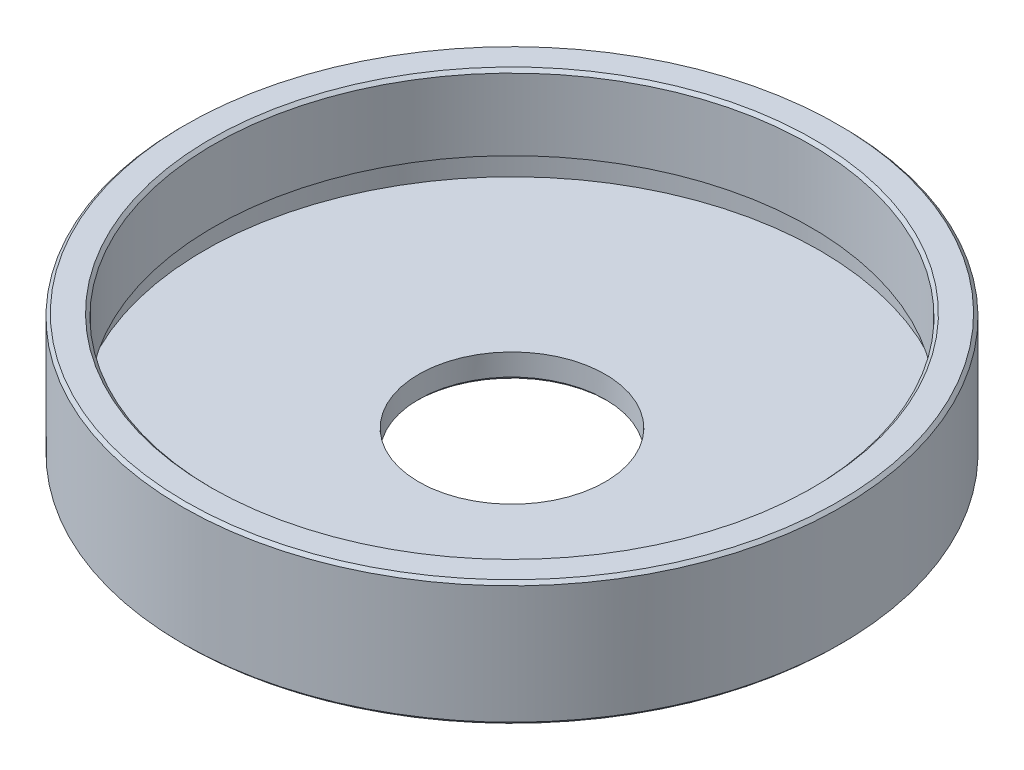
ISO-10303-21;
HEADER;
FILE_DESCRIPTION(('STEP AP214'),'2;1');
FILE_NAME('part.step','',(''),(''),'','','');
FILE_SCHEMA(('AUTOMOTIVE_DESIGN { 1 0 10303 214 1 1 1 1 }'));
ENDSEC;
DATA;
#1=APPLICATION_CONTEXT('core data for automotive mechanical design processes');
#2=APPLICATION_PROTOCOL_DEFINITION('international standard','automotive_design',2000,#1);
#3=PRODUCT_CONTEXT('',#1,'mechanical');
#4=PRODUCT('Part','Part','',(#3));
#5=PRODUCT_RELATED_PRODUCT_CATEGORY('part','',(#4));
#6=PRODUCT_DEFINITION_FORMATION('','',#4);
#7=PRODUCT_DEFINITION_CONTEXT('part definition',#1,'design');
#8=PRODUCT_DEFINITION('design','',#6,#7);
#9=PRODUCT_DEFINITION_SHAPE('','',#8);
#10=(LENGTH_UNIT() NAMED_UNIT(*) SI_UNIT(.MILLI.,.METRE.));
#11=(NAMED_UNIT(*) PLANE_ANGLE_UNIT() SI_UNIT($,.RADIAN.));
#12=(NAMED_UNIT(*) SI_UNIT($,.STERADIAN.) SOLID_ANGLE_UNIT());
#13=UNCERTAINTY_MEASURE_WITH_UNIT(LENGTH_MEASURE(1.E-05),#10,'distance_accuracy_value','');
#14=(GEOMETRIC_REPRESENTATION_CONTEXT(3) GLOBAL_UNCERTAINTY_ASSIGNED_CONTEXT((#13)) GLOBAL_UNIT_ASSIGNED_CONTEXT((#10,
#11,#12)) REPRESENTATION_CONTEXT('',''));
#15=CARTESIAN_POINT('',(0.,0.,0.));
#16=DIRECTION('',(0.,0.,1.));
#17=DIRECTION('',(1.,0.,0.));
#18=AXIS2_PLACEMENT_3D('',#15,#16,#17);
#19=CARTESIAN_POINT('',(48.,20.,-3.35182208528941E-13));
#20=DIRECTION('',(0.,1.,0.));
#21=DIRECTION('',(0.,0.,1.));
#22=AXIS2_PLACEMENT_3D('',#19,#20,#21);
#23=PLANE('',#22);
#24=CARTESIAN_POINT('',(0.,20.,0.));
#25=DIRECTION('',(0.,1.,0.));
#26=DIRECTION('',(0.,0.,1.));
#27=AXIS2_PLACEMENT_3D('',#24,#25,#26);
#28=CIRCLE('',#27,52.5);
#29=CARTESIAN_POINT('',(0.,20.,52.5));
#30=VERTEX_POINT('',#29);
#31=EDGE_CURVE('E42',#30,#30,#28,.T.);
#32=ORIENTED_EDGE('',*,*,#31,.T.);
#33=EDGE_LOOP('',(#32));
#34=FACE_BOUND('',#33,.T.);
#35=CARTESIAN_POINT('',(0.,20.,0.));
#36=DIRECTION('',(0.,1.,0.));
#37=DIRECTION('',(0.,0.,1.));
#38=AXIS2_PLACEMENT_3D('',#35,#36,#37);
#39=CIRCLE('',#38,48.5);
#40=CARTESIAN_POINT('',(0.,20.,48.5));
#41=VERTEX_POINT('',#40);
#42=EDGE_CURVE('E46',#41,#41,#39,.F.);
#43=ORIENTED_EDGE('',*,*,#42,.T.);
#44=EDGE_LOOP('',(#43));
#45=FACE_BOUND('',#44,.T.);
#46=ADVANCED_FACE('F35',(#34,#45),#23,.T.);
#47=CARTESIAN_POINT('',(0.,26.1689859870494,0.));
#48=DIRECTION('',(0.,1.,0.));
#49=DIRECTION('',(0.,0.,1.));
#50=AXIS2_PLACEMENT_3D('',#47,#48,#49);
#51=CYLINDRICAL_SURFACE('',#50,53.);
#52=CARTESIAN_POINT('',(0.,0.499999999999959,0.));
#53=DIRECTION('',(0.,-1.,0.));
#54=DIRECTION('',(0.,0.,-1.));
#55=AXIS2_PLACEMENT_3D('',#52,#53,#54);
#56=CIRCLE('',#55,53.);
#57=CARTESIAN_POINT('',(0.,0.499999999999959,-53.));
#58=VERTEX_POINT('',#57);
#59=EDGE_CURVE('E50',#58,#58,#56,.F.);
#60=ORIENTED_EDGE('',*,*,#59,.T.);
#61=EDGE_LOOP('',(#60));
#62=FACE_BOUND('',#61,.T.);
#63=CARTESIAN_POINT('',(0.,19.5,0.));
#64=DIRECTION('',(0.,1.,0.));
#65=DIRECTION('',(0.,0.,1.));
#66=AXIS2_PLACEMENT_3D('',#63,#64,#65);
#67=CIRCLE('',#66,53.);
#68=CARTESIAN_POINT('',(0.,19.5,53.));
#69=VERTEX_POINT('',#68);
#70=EDGE_CURVE('E55',#69,#69,#67,.F.);
#71=ORIENTED_EDGE('',*,*,#70,.T.);
#72=EDGE_LOOP('',(#71));
#73=FACE_BOUND('',#72,.T.);
#74=ADVANCED_FACE('F97',(#62,#73),#51,.T.);
#75=CARTESIAN_POINT('',(53.,0.,-3.70097021917372E-13));
#76=DIRECTION('',(0.,-1.,0.));
#77=DIRECTION('',(0.,0.,-1.));
#78=AXIS2_PLACEMENT_3D('',#75,#76,#77);
#79=PLANE('',#78);
#80=CARTESIAN_POINT('',(0.,0.,0.));
#81=DIRECTION('',(0.,-1.,0.));
#82=DIRECTION('',(0.,0.,-1.));
#83=AXIS2_PLACEMENT_3D('',#80,#81,#82);
#84=CIRCLE('',#83,15.5);
#85=CARTESIAN_POINT('',(0.,0.,-15.5));
#86=VERTEX_POINT('',#85);
#87=EDGE_CURVE('E61',#86,#86,#84,.F.);
#88=ORIENTED_EDGE('',*,*,#87,.T.);
#89=EDGE_LOOP('',(#88));
#90=FACE_BOUND('',#89,.T.);
#91=CARTESIAN_POINT('',(0.,0.,0.));
#92=DIRECTION('',(0.,-1.,0.));
#93=DIRECTION('',(0.,0.,-1.));
#94=AXIS2_PLACEMENT_3D('',#91,#92,#93);
#95=CIRCLE('',#94,52.5);
#96=CARTESIAN_POINT('',(0.,0.,-52.5));
#97=VERTEX_POINT('',#96);
#98=EDGE_CURVE('E64',#97,#97,#95,.T.);
#99=ORIENTED_EDGE('',*,*,#98,.T.);
#100=EDGE_LOOP('',(#99));
#101=FACE_BOUND('',#100,.T.);
#102=ADVANCED_FACE('F102',(#90,#101),#79,.T.);
#103=CARTESIAN_POINT('',(0.,26.1689859870494,0.));
#104=DIRECTION('',(0.,1.,0.));
#105=DIRECTION('',(0.,0.,1.));
#106=AXIS2_PLACEMENT_3D('',#103,#104,#105);
#107=CYLINDRICAL_SURFACE('',#106,15.);
#108=CARTESIAN_POINT('',(0.,0.499999999999962,0.));
#109=DIRECTION('',(0.,-1.,0.));
#110=DIRECTION('',(0.,0.,-1.));
#111=AXIS2_PLACEMENT_3D('',#108,#109,#110);
#112=CIRCLE('',#111,15.);
#113=CARTESIAN_POINT('',(0.,0.499999999999962,-15.));
#114=VERTEX_POINT('',#113);
#115=EDGE_CURVE('E58',#114,#114,#112,.T.);
#116=ORIENTED_EDGE('',*,*,#115,.T.);
#117=EDGE_LOOP('',(#116));
#118=FACE_BOUND('',#117,.T.);
#119=CARTESIAN_POINT('',(0.,4.,0.));
#120=DIRECTION('',(0.,1.,0.));
#121=DIRECTION('',(0.,0.,1.));
#122=AXIS2_PLACEMENT_3D('',#119,#120,#121);
#123=CIRCLE('',#122,15.);
#124=CARTESIAN_POINT('',(0.,4.,15.));
#125=VERTEX_POINT('',#124);
#126=EDGE_CURVE('E67',#125,#125,#123,.T.);
#127=ORIENTED_EDGE('',*,*,#126,.T.);
#128=EDGE_LOOP('',(#127));
#129=FACE_BOUND('',#128,.T.);
#130=ADVANCED_FACE('F153',(#118,#129),#107,.F.);
#131=CARTESIAN_POINT('',(15.,4.,-1.04744440165294E-13));
#132=DIRECTION('',(0.,1.,0.));
#133=DIRECTION('',(0.,0.,1.));
#134=AXIS2_PLACEMENT_3D('',#131,#132,#133);
#135=PLANE('',#134);
#136=CARTESIAN_POINT('',(0.,4.,0.));
#137=DIRECTION('',(0.,1.,0.));
#138=DIRECTION('',(0.,0.,1.));
#139=AXIS2_PLACEMENT_3D('',#136,#137,#138);
#140=CIRCLE('',#139,49.5);
#141=CARTESIAN_POINT('',(0.,4.,49.5));
#142=VERTEX_POINT('',#141);
#143=EDGE_CURVE('E70',#142,#142,#140,.T.);
#144=ORIENTED_EDGE('',*,*,#143,.T.);
#145=EDGE_LOOP('',(#144));
#146=FACE_BOUND('',#145,.T.);
#147=ORIENTED_EDGE('',*,*,#126,.F.);
#148=EDGE_LOOP('',(#147));
#149=FACE_BOUND('',#148,.T.);
#150=ADVANCED_FACE('F158',(#146,#149),#135,.T.);
#151=CARTESIAN_POINT('',(0.,26.1689859870494,0.));
#152=DIRECTION('',(0.,1.,0.));
#153=DIRECTION('',(0.,0.,1.));
#154=AXIS2_PLACEMENT_3D('',#151,#152,#153);
#155=CYLINDRICAL_SURFACE('',#154,49.5);
#156=CARTESIAN_POINT('',(0.,8.,0.));
#157=DIRECTION('',(0.,1.,0.));
#158=DIRECTION('',(0.,0.,1.));
#159=AXIS2_PLACEMENT_3D('',#156,#157,#158);
#160=CIRCLE('',#159,49.5);
#161=CARTESIAN_POINT('',(0.,8.,49.5));
#162=VERTEX_POINT('',#161);
#163=EDGE_CURVE('E73',#162,#162,#160,.T.);
#164=ORIENTED_EDGE('',*,*,#163,.T.);
#165=EDGE_LOOP('',(#164));
#166=FACE_BOUND('',#165,.T.);
#167=ORIENTED_EDGE('',*,*,#143,.F.);
#168=EDGE_LOOP('',(#167));
#169=FACE_BOUND('',#168,.T.);
#170=ADVANCED_FACE('F94',(#166,#169),#155,.F.);
#171=CARTESIAN_POINT('',(49.5,8.,-3.4565665254547E-13));
#172=DIRECTION('',(0.,-1.,0.));
#173=DIRECTION('',(0.,0.,-1.));
#174=AXIS2_PLACEMENT_3D('',#171,#172,#173);
#175=PLANE('',#174);
#176=CARTESIAN_POINT('',(0.,8.,0.));
#177=DIRECTION('',(0.,1.,0.));
#178=DIRECTION('',(0.,0.,1.));
#179=AXIS2_PLACEMENT_3D('',#176,#177,#178);
#180=CIRCLE('',#179,48.);
#181=CARTESIAN_POINT('',(0.,8.,48.));
#182=VERTEX_POINT('',#181);
#183=EDGE_CURVE('E76',#182,#182,#180,.T.);
#184=ORIENTED_EDGE('',*,*,#183,.T.);
#185=EDGE_LOOP('',(#184));
#186=FACE_BOUND('',#185,.T.);
#187=ORIENTED_EDGE('',*,*,#163,.F.);
#188=EDGE_LOOP('',(#187));
#189=FACE_BOUND('',#188,.T.);
#190=ADVANCED_FACE('F80',(#186,#189),#175,.T.);
#191=CARTESIAN_POINT('',(0.,26.1689859870494,0.));
#192=DIRECTION('',(0.,1.,0.));
#193=DIRECTION('',(0.,0.,1.));
#194=AXIS2_PLACEMENT_3D('',#191,#192,#193);
#195=CYLINDRICAL_SURFACE('',#194,48.);
#196=CARTESIAN_POINT('',(0.,19.5,0.));
#197=DIRECTION('',(0.,1.,0.));
#198=DIRECTION('',(0.,0.,1.));
#199=AXIS2_PLACEMENT_3D('',#196,#197,#198);
#200=CIRCLE('',#199,48.);
#201=CARTESIAN_POINT('',(0.,19.5,48.));
#202=VERTEX_POINT('',#201);
#203=EDGE_CURVE('E10',#202,#202,#200,.T.);
#204=ORIENTED_EDGE('',*,*,#203,.T.);
#205=EDGE_LOOP('',(#204));
#206=FACE_BOUND('',#205,.T.);
#207=ORIENTED_EDGE('',*,*,#183,.F.);
#208=EDGE_LOOP('',(#207));
#209=FACE_BOUND('',#208,.T.);
#210=ADVANCED_FACE('F83',(#206,#209),#195,.F.);
#211=CARTESIAN_POINT('',(0.,0.,0.));
#212=DIRECTION('',(0.,-1.,0.));
#213=DIRECTION('',(0.,0.,-1.));
#214=AXIS2_PLACEMENT_3D('',#211,#212,#213);
#215=CONICAL_SURFACE('',#214,15.5,0.785398163397447);
#216=ORIENTED_EDGE('',*,*,#115,.F.);
#217=EDGE_LOOP('',(#216));
#218=FACE_BOUND('',#217,.T.);
#219=ORIENTED_EDGE('',*,*,#87,.F.);
#220=EDGE_LOOP('',(#219));
#221=FACE_BOUND('',#220,.T.);
#222=ADVANCED_FACE('F85',(#218,#221),#215,.F.);
#223=CARTESIAN_POINT('',(0.,0.499999999999959,0.));
#224=DIRECTION('',(0.,1.,0.));
#225=DIRECTION('',(0.,0.,1.));
#226=AXIS2_PLACEMENT_3D('',#223,#224,#225);
#227=CONICAL_SURFACE('',#226,53.,0.785398163397469);
#228=ORIENTED_EDGE('',*,*,#98,.F.);
#229=EDGE_LOOP('',(#228));
#230=FACE_BOUND('',#229,.T.);
#231=ORIENTED_EDGE('',*,*,#59,.F.);
#232=EDGE_LOOP('',(#231));
#233=FACE_BOUND('',#232,.T.);
#234=ADVANCED_FACE('F91',(#230,#233),#227,.T.);
#235=CARTESIAN_POINT('',(0.,20.,0.));
#236=DIRECTION('',(0.,-1.,0.));
#237=DIRECTION('',(0.,0.,-1.));
#238=AXIS2_PLACEMENT_3D('',#235,#236,#237);
#239=CONICAL_SURFACE('',#238,52.5,0.785398163397455);
#240=ORIENTED_EDGE('',*,*,#70,.F.);
#241=EDGE_LOOP('',(#240));
#242=FACE_BOUND('',#241,.T.);
#243=ORIENTED_EDGE('',*,*,#31,.F.);
#244=EDGE_LOOP('',(#243));
#245=FACE_BOUND('',#244,.T.);
#246=ADVANCED_FACE('F109',(#242,#245),#239,.T.);
#247=CARTESIAN_POINT('',(0.,19.5,0.));
#248=DIRECTION('',(0.,1.,0.));
#249=DIRECTION('',(0.,0.,1.));
#250=AXIS2_PLACEMENT_3D('',#247,#248,#249);
#251=CONICAL_SURFACE('',#250,48.,0.785398163397455);
#252=ORIENTED_EDGE('',*,*,#42,.F.);
#253=EDGE_LOOP('',(#252));
#254=FACE_BOUND('',#253,.T.);
#255=ORIENTED_EDGE('',*,*,#203,.F.);
#256=EDGE_LOOP('',(#255));
#257=FACE_BOUND('',#256,.T.);
#258=ADVANCED_FACE('F37',(#254,#257),#251,.F.);
#259=CLOSED_SHELL('',(#46,#74,#102,#130,#150,#170,#190,#210,#222,#234,#246,#258));
#260=MANIFOLD_SOLID_BREP('B2',#259);
#261=ADVANCED_BREP_SHAPE_REPRESENTATION('',(#18,#260),#14);
#262=SHAPE_DEFINITION_REPRESENTATION(#9,#261);
ENDSEC;
END-ISO-10303-21;
